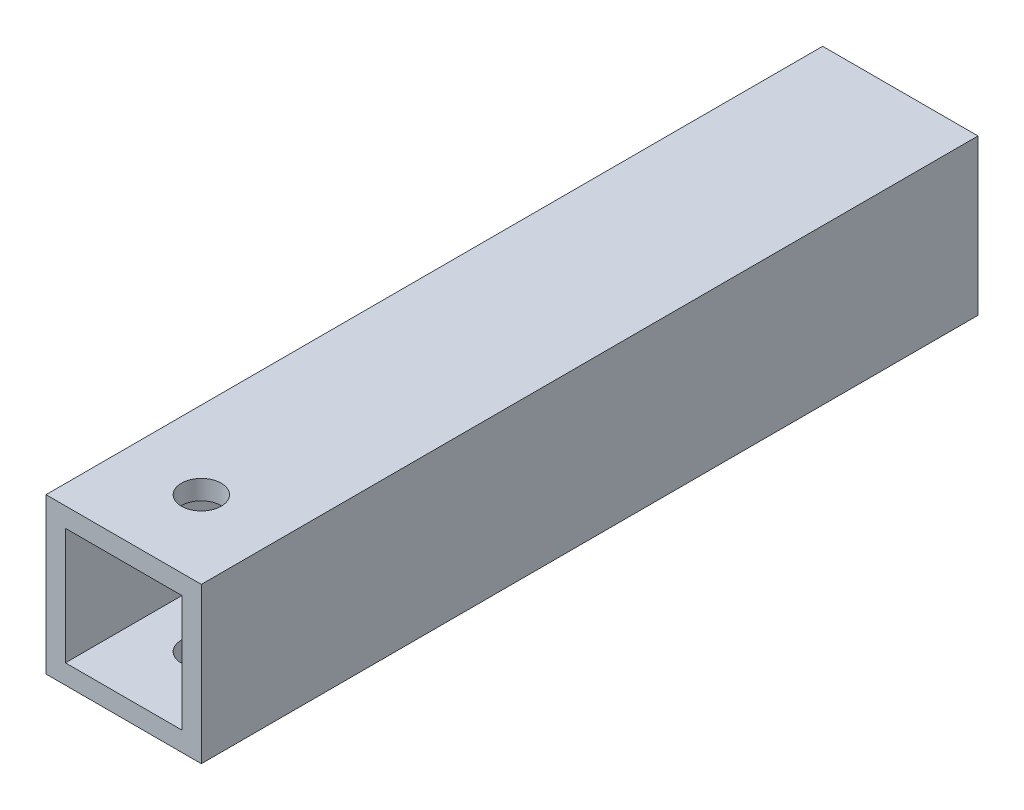
ISO-10303-21;
HEADER;
FILE_DESCRIPTION(('STEP AP214'),'2;1');
FILE_NAME('part.step','',(''),(''),'','','');
FILE_SCHEMA(('AUTOMOTIVE_DESIGN { 1 0 10303 214 1 1 1 1 }'));
ENDSEC;
DATA;
#1=APPLICATION_CONTEXT('core data for automotive mechanical design processes');
#2=APPLICATION_PROTOCOL_DEFINITION('international standard','automotive_design',2000,#1);
#3=PRODUCT_CONTEXT('',#1,'mechanical');
#4=PRODUCT('Part','Part','',(#3));
#5=PRODUCT_RELATED_PRODUCT_CATEGORY('part','',(#4));
#6=PRODUCT_DEFINITION_FORMATION('','',#4);
#7=PRODUCT_DEFINITION_CONTEXT('part definition',#1,'design');
#8=PRODUCT_DEFINITION('design','',#6,#7);
#9=PRODUCT_DEFINITION_SHAPE('','',#8);
#10=(LENGTH_UNIT() NAMED_UNIT(*) SI_UNIT(.MILLI.,.METRE.));
#11=(NAMED_UNIT(*) PLANE_ANGLE_UNIT() SI_UNIT($,.RADIAN.));
#12=(NAMED_UNIT(*) SI_UNIT($,.STERADIAN.) SOLID_ANGLE_UNIT());
#13=UNCERTAINTY_MEASURE_WITH_UNIT(LENGTH_MEASURE(1.E-05),#10,'distance_accuracy_value','');
#14=(GEOMETRIC_REPRESENTATION_CONTEXT(3) GLOBAL_UNCERTAINTY_ASSIGNED_CONTEXT((#13)) GLOBAL_UNIT_ASSIGNED_CONTEXT((#10,
#11,#12)) REPRESENTATION_CONTEXT('',''));
#15=CARTESIAN_POINT('',(0.,0.,0.));
#16=DIRECTION('',(0.,0.,1.));
#17=DIRECTION('',(1.,0.,0.));
#18=AXIS2_PLACEMENT_3D('',#15,#16,#17);
#19=CARTESIAN_POINT('',(0.,0.,127.));
#20=DIRECTION('',(0.,0.,1.));
#21=DIRECTION('',(1.,0.,0.));
#22=AXIS2_PLACEMENT_3D('',#19,#20,#21);
#23=PLANE('',#22);
#24=DIRECTION('',(0.,-1.,0.));
#25=VECTOR('',#24,1.);
#26=CARTESIAN_POINT('',(-12.7,-12.7,127.));
#27=LINE('',#26,#25);
#28=CARTESIAN_POINT('',(-12.7,12.7,127.));
#29=VERTEX_POINT('',#28);
#30=CARTESIAN_POINT('',(-12.7,-12.7,127.));
#31=VERTEX_POINT('',#30);
#32=EDGE_CURVE('E140',#29,#31,#27,.T.);
#33=ORIENTED_EDGE('',*,*,#32,.T.);
#34=DIRECTION('',(1.,0.,0.));
#35=VECTOR('',#34,1.);
#36=CARTESIAN_POINT('',(12.7,-12.7,127.));
#37=LINE('',#36,#35);
#38=CARTESIAN_POINT('',(12.7,-12.7,127.));
#39=VERTEX_POINT('',#38);
#40=EDGE_CURVE('E143',#31,#39,#37,.T.);
#41=ORIENTED_EDGE('',*,*,#40,.T.);
#42=DIRECTION('',(0.,1.,0.));
#43=VECTOR('',#42,1.);
#44=CARTESIAN_POINT('',(12.7,-12.7,127.));
#45=LINE('',#44,#43);
#46=CARTESIAN_POINT('',(12.7,12.7,127.));
#47=VERTEX_POINT('',#46);
#48=EDGE_CURVE('E146',#39,#47,#45,.T.);
#49=ORIENTED_EDGE('',*,*,#48,.T.);
#50=DIRECTION('',(-1.,0.,0.));
#51=VECTOR('',#50,1.);
#52=CARTESIAN_POINT('',(12.7,12.7,127.));
#53=LINE('',#52,#51);
#54=EDGE_CURVE('E148',#47,#29,#53,.T.);
#55=ORIENTED_EDGE('',*,*,#54,.T.);
#56=EDGE_LOOP('',(#33,#41,#49,#55));
#57=FACE_BOUND('',#56,.T.);
#58=DIRECTION('',(1.,0.,0.));
#59=VECTOR('',#58,1.);
#60=CARTESIAN_POINT('',(9.52499999999999,-9.52499999999998,127.));
#61=LINE('',#60,#59);
#62=CARTESIAN_POINT('',(-9.52499999999999,-9.52499999999998,127.));
#63=VERTEX_POINT('',#62);
#64=CARTESIAN_POINT('',(9.52499999999999,-9.52499999999998,127.));
#65=VERTEX_POINT('',#64);
#66=EDGE_CURVE('E110',#63,#65,#61,.T.);
#67=ORIENTED_EDGE('',*,*,#66,.F.);
#68=DIRECTION('',(0.,-1.,0.));
#69=VECTOR('',#68,1.);
#70=CARTESIAN_POINT('',(-9.52499999999999,-9.52499999999998,127.));
#71=LINE('',#70,#69);
#72=CARTESIAN_POINT('',(-9.52499999999999,9.52499999999998,127.));
#73=VERTEX_POINT('',#72);
#74=EDGE_CURVE('E102',#73,#63,#71,.T.);
#75=ORIENTED_EDGE('',*,*,#74,.F.);
#76=DIRECTION('',(-1.,0.,0.));
#77=VECTOR('',#76,1.);
#78=CARTESIAN_POINT('',(9.52499999999999,9.52499999999998,127.));
#79=LINE('',#78,#77);
#80=CARTESIAN_POINT('',(9.52499999999999,9.52499999999998,127.));
#81=VERTEX_POINT('',#80);
#82=EDGE_CURVE('E124',#81,#73,#79,.T.);
#83=ORIENTED_EDGE('',*,*,#82,.F.);
#84=DIRECTION('',(0.,1.,0.));
#85=VECTOR('',#84,1.);
#86=CARTESIAN_POINT('',(9.52499999999999,-9.52499999999998,127.));
#87=LINE('',#86,#85);
#88=EDGE_CURVE('E122',#65,#81,#87,.T.);
#89=ORIENTED_EDGE('',*,*,#88,.F.);
#90=EDGE_LOOP('',(#67,#75,#83,#89));
#91=FACE_BOUND('',#90,.T.);
#92=ADVANCED_FACE('F36',(#57,#91),#23,.T.);
#93=CARTESIAN_POINT('',(0.,0.,0.));
#94=DIRECTION('',(0.,0.,1.));
#95=DIRECTION('',(1.,0.,0.));
#96=AXIS2_PLACEMENT_3D('',#93,#94,#95);
#97=PLANE('',#96);
#98=DIRECTION('',(0.,-1.,0.));
#99=VECTOR('',#98,1.);
#100=CARTESIAN_POINT('',(-12.7,-12.7,0.));
#101=LINE('',#100,#99);
#102=CARTESIAN_POINT('',(-12.7,12.7,0.));
#103=VERTEX_POINT('',#102);
#104=CARTESIAN_POINT('',(-12.7,-12.7,0.));
#105=VERTEX_POINT('',#104);
#106=EDGE_CURVE('E118',#103,#105,#101,.T.);
#107=ORIENTED_EDGE('',*,*,#106,.F.);
#108=DIRECTION('',(-1.,0.,0.));
#109=VECTOR('',#108,1.);
#110=CARTESIAN_POINT('',(12.7,12.7,0.));
#111=LINE('',#110,#109);
#112=CARTESIAN_POINT('',(12.7,12.7,0.));
#113=VERTEX_POINT('',#112);
#114=EDGE_CURVE('E144',#113,#103,#111,.T.);
#115=ORIENTED_EDGE('',*,*,#114,.F.);
#116=DIRECTION('',(0.,1.,0.));
#117=VECTOR('',#116,1.);
#118=CARTESIAN_POINT('',(12.7,-12.7,0.));
#119=LINE('',#118,#117);
#120=CARTESIAN_POINT('',(12.7,-12.7,0.));
#121=VERTEX_POINT('',#120);
#122=EDGE_CURVE('E155',#121,#113,#119,.T.);
#123=ORIENTED_EDGE('',*,*,#122,.F.);
#124=DIRECTION('',(1.,0.,0.));
#125=VECTOR('',#124,1.);
#126=CARTESIAN_POINT('',(12.7,-12.7,0.));
#127=LINE('',#126,#125);
#128=EDGE_CURVE('E153',#105,#121,#127,.T.);
#129=ORIENTED_EDGE('',*,*,#128,.F.);
#130=EDGE_LOOP('',(#107,#115,#123,#129));
#131=FACE_BOUND('',#130,.T.);
#132=DIRECTION('',(0.,-1.,0.));
#133=VECTOR('',#132,1.);
#134=CARTESIAN_POINT('',(-9.52499999999999,-9.52499999999998,0.));
#135=LINE('',#134,#133);
#136=CARTESIAN_POINT('',(-9.52499999999999,9.52499999999998,0.));
#137=VERTEX_POINT('',#136);
#138=CARTESIAN_POINT('',(-9.52499999999999,-9.52499999999998,0.));
#139=VERTEX_POINT('',#138);
#140=EDGE_CURVE('E60',#137,#139,#135,.T.);
#141=ORIENTED_EDGE('',*,*,#140,.T.);
#142=DIRECTION('',(1.,0.,0.));
#143=VECTOR('',#142,1.);
#144=CARTESIAN_POINT('',(9.52499999999999,-9.52499999999998,0.));
#145=LINE('',#144,#143);
#146=CARTESIAN_POINT('',(9.52499999999999,-9.52499999999998,0.));
#147=VERTEX_POINT('',#146);
#148=EDGE_CURVE('E117',#139,#147,#145,.T.);
#149=ORIENTED_EDGE('',*,*,#148,.T.);
#150=DIRECTION('',(0.,1.,0.));
#151=VECTOR('',#150,1.);
#152=CARTESIAN_POINT('',(9.52499999999999,-9.52499999999998,0.));
#153=LINE('',#152,#151);
#154=CARTESIAN_POINT('',(9.52499999999999,9.52499999999998,0.));
#155=VERTEX_POINT('',#154);
#156=EDGE_CURVE('E132',#147,#155,#153,.T.);
#157=ORIENTED_EDGE('',*,*,#156,.T.);
#158=DIRECTION('',(-1.,0.,0.));
#159=VECTOR('',#158,1.);
#160=CARTESIAN_POINT('',(9.52499999999999,9.52499999999998,0.));
#161=LINE('',#160,#159);
#162=EDGE_CURVE('E111',#155,#137,#161,.T.);
#163=ORIENTED_EDGE('',*,*,#162,.T.);
#164=EDGE_LOOP('',(#141,#149,#157,#163));
#165=FACE_BOUND('',#164,.T.);
#166=ADVANCED_FACE('F174',(#131,#165),#97,.F.);
#167=CARTESIAN_POINT('',(-12.7,-12.7,127.));
#168=DIRECTION('',(1.,0.,0.));
#169=DIRECTION('',(0.,0.,-1.));
#170=AXIS2_PLACEMENT_3D('',#167,#168,#169);
#171=PLANE('',#170);
#172=ORIENTED_EDGE('',*,*,#106,.T.);
#173=DIRECTION('',(0.,0.,-1.));
#174=VECTOR('',#173,1.);
#175=CARTESIAN_POINT('',(-12.7,-12.7,127.));
#176=LINE('',#175,#174);
#177=EDGE_CURVE('E11',#31,#105,#176,.T.);
#178=ORIENTED_EDGE('',*,*,#177,.F.);
#179=ORIENTED_EDGE('',*,*,#32,.F.);
#180=DIRECTION('',(0.,0.,-1.));
#181=VECTOR('',#180,1.);
#182=CARTESIAN_POINT('',(-12.7,12.7,127.));
#183=LINE('',#182,#181);
#184=EDGE_CURVE('E150',#29,#103,#183,.T.);
#185=ORIENTED_EDGE('',*,*,#184,.T.);
#186=EDGE_LOOP('',(#172,#178,#179,#185));
#187=FACE_BOUND('',#186,.T.);
#188=ADVANCED_FACE('F38',(#187),#171,.F.);
#189=CARTESIAN_POINT('',(12.7,-12.7,127.));
#190=DIRECTION('',(0.,1.,0.));
#191=DIRECTION('',(-1.,0.,0.));
#192=AXIS2_PLACEMENT_3D('',#189,#190,#191);
#193=PLANE('',#192);
#194=CARTESIAN_POINT('',(0.,-12.7,114.3));
#195=DIRECTION('',(0.,1.,0.));
#196=DIRECTION('',(-1.,0.,0.));
#197=AXIS2_PLACEMENT_3D('',#194,#195,#196);
#198=CIRCLE('',#197,3.2639);
#199=CARTESIAN_POINT('',(-3.26389999999998,-12.7,114.3));
#200=VERTEX_POINT('',#199);
#201=EDGE_CURVE('E214',#200,#200,#198,.T.);
#202=ORIENTED_EDGE('',*,*,#201,.T.);
#203=EDGE_LOOP('',(#202));
#204=FACE_BOUND('',#203,.T.);
#205=ORIENTED_EDGE('',*,*,#128,.T.);
#206=DIRECTION('',(0.,0.,-1.));
#207=VECTOR('',#206,1.);
#208=CARTESIAN_POINT('',(12.7,-12.7,127.));
#209=LINE('',#208,#207);
#210=EDGE_CURVE('E45',#39,#121,#209,.T.);
#211=ORIENTED_EDGE('',*,*,#210,.F.);
#212=ORIENTED_EDGE('',*,*,#40,.F.);
#213=ORIENTED_EDGE('',*,*,#177,.T.);
#214=EDGE_LOOP('',(#205,#211,#212,#213));
#215=FACE_BOUND('',#214,.T.);
#216=ADVANCED_FACE('F184',(#204,#215),#193,.F.);
#217=CARTESIAN_POINT('',(12.7,-12.7,127.));
#218=DIRECTION('',(-1.,0.,0.));
#219=DIRECTION('',(0.,0.,1.));
#220=AXIS2_PLACEMENT_3D('',#217,#218,#219);
#221=PLANE('',#220);
#222=ORIENTED_EDGE('',*,*,#122,.T.);
#223=DIRECTION('',(0.,0.,-1.));
#224=VECTOR('',#223,1.);
#225=CARTESIAN_POINT('',(12.7,12.7,127.));
#226=LINE('',#225,#224);
#227=EDGE_CURVE('E160',#47,#113,#226,.T.);
#228=ORIENTED_EDGE('',*,*,#227,.F.);
#229=ORIENTED_EDGE('',*,*,#48,.F.);
#230=ORIENTED_EDGE('',*,*,#210,.T.);
#231=EDGE_LOOP('',(#222,#228,#229,#230));
#232=FACE_BOUND('',#231,.T.);
#233=ADVANCED_FACE('F168',(#232),#221,.F.);
#234=CARTESIAN_POINT('',(12.7,12.7,127.));
#235=DIRECTION('',(0.,-1.,0.));
#236=DIRECTION('',(1.,0.,0.));
#237=AXIS2_PLACEMENT_3D('',#234,#235,#236);
#238=PLANE('',#237);
#239=CARTESIAN_POINT('',(0.,12.7,114.3));
#240=DIRECTION('',(0.,-1.,0.));
#241=DIRECTION('',(1.,0.,0.));
#242=AXIS2_PLACEMENT_3D('',#239,#240,#241);
#243=CIRCLE('',#242,3.2639);
#244=CARTESIAN_POINT('',(3.26390000000001,12.7,114.3));
#245=VERTEX_POINT('',#244);
#246=EDGE_CURVE('E130',#245,#245,#243,.T.);
#247=ORIENTED_EDGE('',*,*,#246,.T.);
#248=EDGE_LOOP('',(#247));
#249=FACE_BOUND('',#248,.T.);
#250=ORIENTED_EDGE('',*,*,#114,.T.);
#251=ORIENTED_EDGE('',*,*,#184,.F.);
#252=ORIENTED_EDGE('',*,*,#54,.F.);
#253=ORIENTED_EDGE('',*,*,#227,.T.);
#254=EDGE_LOOP('',(#250,#251,#252,#253));
#255=FACE_BOUND('',#254,.T.);
#256=ADVANCED_FACE('F178',(#249,#255),#238,.F.);
#257=CARTESIAN_POINT('',(-9.52499999999999,-9.52499999999998,127.));
#258=DIRECTION('',(1.,0.,0.));
#259=DIRECTION('',(0.,0.,-1.));
#260=AXIS2_PLACEMENT_3D('',#257,#258,#259);
#261=PLANE('',#260);
#262=ORIENTED_EDGE('',*,*,#140,.F.);
#263=DIRECTION('',(0.,0.,-1.));
#264=VECTOR('',#263,1.);
#265=CARTESIAN_POINT('',(-9.52499999999999,9.52499999999998,127.));
#266=LINE('',#265,#264);
#267=EDGE_CURVE('E106',#73,#137,#266,.T.);
#268=ORIENTED_EDGE('',*,*,#267,.F.);
#269=ORIENTED_EDGE('',*,*,#74,.T.);
#270=DIRECTION('',(0.,0.,-1.));
#271=VECTOR('',#270,1.);
#272=CARTESIAN_POINT('',(-9.52499999999999,-9.52499999999998,127.));
#273=LINE('',#272,#271);
#274=EDGE_CURVE('E105',#63,#139,#273,.T.);
#275=ORIENTED_EDGE('',*,*,#274,.T.);
#276=EDGE_LOOP('',(#262,#268,#269,#275));
#277=FACE_BOUND('',#276,.T.);
#278=ADVANCED_FACE('F104',(#277),#261,.T.);
#279=CARTESIAN_POINT('',(9.52499999999999,-9.52499999999998,127.));
#280=DIRECTION('',(0.,1.,0.));
#281=DIRECTION('',(0.,0.,1.));
#282=AXIS2_PLACEMENT_3D('',#279,#280,#281);
#283=PLANE('',#282);
#284=CARTESIAN_POINT('',(0.,-9.52499999999998,114.3));
#285=DIRECTION('',(0.,1.,0.));
#286=DIRECTION('',(0.,0.,1.));
#287=AXIS2_PLACEMENT_3D('',#284,#285,#286);
#288=CIRCLE('',#287,3.2639);
#289=CARTESIAN_POINT('',(0.,-9.52499999999998,117.5639));
#290=VERTEX_POINT('',#289);
#291=EDGE_CURVE('E210',#290,#290,#288,.T.);
#292=ORIENTED_EDGE('',*,*,#291,.F.);
#293=EDGE_LOOP('',(#292));
#294=FACE_BOUND('',#293,.T.);
#295=ORIENTED_EDGE('',*,*,#148,.F.);
#296=ORIENTED_EDGE('',*,*,#274,.F.);
#297=ORIENTED_EDGE('',*,*,#66,.T.);
#298=DIRECTION('',(0.,0.,-1.));
#299=VECTOR('',#298,1.);
#300=CARTESIAN_POINT('',(9.52499999999999,-9.52499999999998,127.));
#301=LINE('',#300,#299);
#302=EDGE_CURVE('E119',#65,#147,#301,.T.);
#303=ORIENTED_EDGE('',*,*,#302,.T.);
#304=EDGE_LOOP('',(#295,#296,#297,#303));
#305=FACE_BOUND('',#304,.T.);
#306=ADVANCED_FACE('F114',(#294,#305),#283,.T.);
#307=CARTESIAN_POINT('',(9.52499999999999,-9.52499999999998,127.));
#308=DIRECTION('',(-1.,0.,0.));
#309=DIRECTION('',(0.,0.,1.));
#310=AXIS2_PLACEMENT_3D('',#307,#308,#309);
#311=PLANE('',#310);
#312=ORIENTED_EDGE('',*,*,#156,.F.);
#313=ORIENTED_EDGE('',*,*,#302,.F.);
#314=ORIENTED_EDGE('',*,*,#88,.T.);
#315=DIRECTION('',(0.,0.,-1.));
#316=VECTOR('',#315,1.);
#317=CARTESIAN_POINT('',(9.52499999999999,9.52499999999998,127.));
#318=LINE('',#317,#316);
#319=EDGE_CURVE('E52',#81,#155,#318,.T.);
#320=ORIENTED_EDGE('',*,*,#319,.T.);
#321=EDGE_LOOP('',(#312,#313,#314,#320));
#322=FACE_BOUND('',#321,.T.);
#323=ADVANCED_FACE('F223',(#322),#311,.T.);
#324=CARTESIAN_POINT('',(9.52499999999999,9.52499999999998,127.));
#325=DIRECTION('',(0.,-1.,0.));
#326=DIRECTION('',(0.,0.,-1.));
#327=AXIS2_PLACEMENT_3D('',#324,#325,#326);
#328=PLANE('',#327);
#329=CARTESIAN_POINT('',(0.,9.52499999999998,114.3));
#330=DIRECTION('',(0.,-1.,0.));
#331=DIRECTION('',(0.,0.,-1.));
#332=AXIS2_PLACEMENT_3D('',#329,#330,#331);
#333=CIRCLE('',#332,3.2639);
#334=CARTESIAN_POINT('',(0.,9.52499999999998,111.0361));
#335=VERTEX_POINT('',#334);
#336=EDGE_CURVE('E40',#335,#335,#333,.T.);
#337=ORIENTED_EDGE('',*,*,#336,.F.);
#338=EDGE_LOOP('',(#337));
#339=FACE_BOUND('',#338,.T.);
#340=ORIENTED_EDGE('',*,*,#162,.F.);
#341=ORIENTED_EDGE('',*,*,#319,.F.);
#342=ORIENTED_EDGE('',*,*,#82,.T.);
#343=ORIENTED_EDGE('',*,*,#267,.T.);
#344=EDGE_LOOP('',(#340,#341,#342,#343));
#345=FACE_BOUND('',#344,.T.);
#346=ADVANCED_FACE('F221',(#339,#345),#328,.T.);
#347=CARTESIAN_POINT('',(0.,-12.7,114.3));
#348=DIRECTION('',(0.,1.,0.));
#349=DIRECTION('',(-1.,0.,0.));
#350=AXIS2_PLACEMENT_3D('',#347,#348,#349);
#351=CYLINDRICAL_SURFACE('',#350,3.2639);
#352=ORIENTED_EDGE('',*,*,#336,.T.);
#353=EDGE_LOOP('',(#352));
#354=FACE_BOUND('',#353,.T.);
#355=ORIENTED_EDGE('',*,*,#246,.F.);
#356=EDGE_LOOP('',(#355));
#357=FACE_BOUND('',#356,.T.);
#358=ADVANCED_FACE('F219',(#354,#357),#351,.F.);
#359=ORIENTED_EDGE('',*,*,#291,.T.);
#360=EDGE_LOOP('',(#359));
#361=FACE_BOUND('',#360,.T.);
#362=ORIENTED_EDGE('',*,*,#201,.F.);
#363=EDGE_LOOP('',(#362));
#364=FACE_BOUND('',#363,.T.);
#365=ADVANCED_FACE('F235',(#361,#364),#351,.F.);
#366=CLOSED_SHELL('',(#92,#166,#188,#216,#233,#256,#278,#306,#323,#346,#358,#365));
#367=MANIFOLD_SOLID_BREP('B2',#366);
#368=ADVANCED_BREP_SHAPE_REPRESENTATION('',(#18,#367),#14);
#369=SHAPE_DEFINITION_REPRESENTATION(#9,#368);
ENDSEC;
END-ISO-10303-21;
